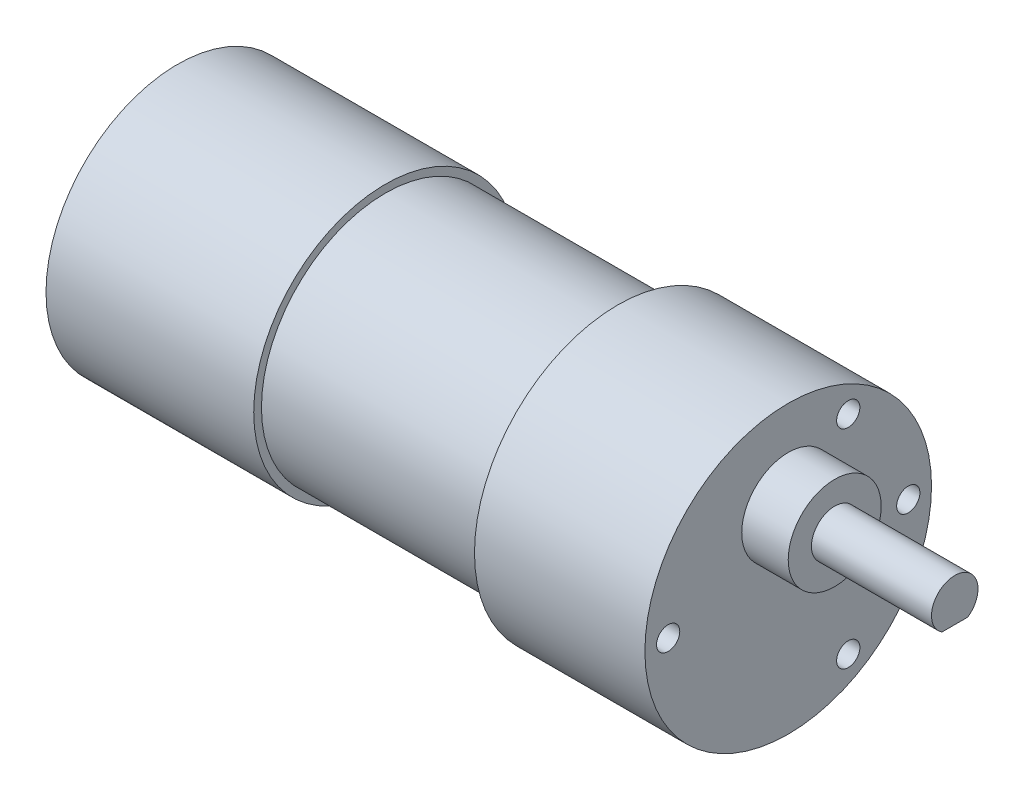
ISO-10303-21;
HEADER;
FILE_DESCRIPTION(('STEP AP214'),'2;1');
FILE_NAME('part.step','',(''),(''),'','','');
FILE_SCHEMA(('AUTOMOTIVE_DESIGN { 1 0 10303 214 1 1 1 1 }'));
ENDSEC;
DATA;
#1=APPLICATION_CONTEXT('core data for automotive mechanical design processes');
#2=APPLICATION_PROTOCOL_DEFINITION('international standard','automotive_design',2000,#1);
#3=PRODUCT_CONTEXT('',#1,'mechanical');
#4=PRODUCT('Part','Part','',(#3));
#5=PRODUCT_RELATED_PRODUCT_CATEGORY('part','',(#4));
#6=PRODUCT_DEFINITION_FORMATION('','',#4);
#7=PRODUCT_DEFINITION_CONTEXT('part definition',#1,'design');
#8=PRODUCT_DEFINITION('design','',#6,#7);
#9=PRODUCT_DEFINITION_SHAPE('','',#8);
#10=(LENGTH_UNIT() NAMED_UNIT(*) SI_UNIT(.MILLI.,.METRE.));
#11=(NAMED_UNIT(*) PLANE_ANGLE_UNIT() SI_UNIT($,.RADIAN.));
#12=(NAMED_UNIT(*) SI_UNIT($,.STERADIAN.) SOLID_ANGLE_UNIT());
#13=UNCERTAINTY_MEASURE_WITH_UNIT(LENGTH_MEASURE(1.E-05),#10,'distance_accuracy_value','');
#14=(GEOMETRIC_REPRESENTATION_CONTEXT(3) GLOBAL_UNCERTAINTY_ASSIGNED_CONTEXT((#13)) GLOBAL_UNIT_ASSIGNED_CONTEXT((#10,
#11,#12)) REPRESENTATION_CONTEXT('',''));
#15=CARTESIAN_POINT('',(0.,0.,0.));
#16=DIRECTION('',(0.,0.,1.));
#17=DIRECTION('',(1.,0.,0.));
#18=AXIS2_PLACEMENT_3D('',#15,#16,#17);
#19=CARTESIAN_POINT('',(60.,7.,0.));
#20=DIRECTION('',(1.,0.,0.));
#21=DIRECTION('',(0.,0.,-1.));
#22=AXIS2_PLACEMENT_3D('',#19,#20,#21);
#23=PLANE('',#22);
#24=CARTESIAN_POINT('',(60.,7.,0.));
#25=DIRECTION('',(1.,0.,0.));
#26=DIRECTION('',(0.,0.,-1.));
#27=AXIS2_PLACEMENT_3D('',#24,#25,#26);
#28=CIRCLE('',#27,6.);
#29=CARTESIAN_POINT('',(60.,7.,-6.));
#30=VERTEX_POINT('',#29);
#31=EDGE_CURVE('E72',#30,#30,#28,.T.);
#32=ORIENTED_EDGE('',*,*,#31,.T.);
#33=EDGE_LOOP('',(#32));
#34=FACE_BOUND('',#33,.T.);
#35=CARTESIAN_POINT('',(60.,7.,0.));
#36=DIRECTION('',(1.,0.,0.));
#37=DIRECTION('',(0.,0.,-1.));
#38=AXIS2_PLACEMENT_3D('',#35,#36,#37);
#39=CIRCLE('',#38,3.);
#40=CARTESIAN_POINT('',(60.,7.,-3.));
#41=VERTEX_POINT('',#40);
#42=EDGE_CURVE('E73',#41,#41,#39,.T.);
#43=ORIENTED_EDGE('',*,*,#42,.F.);
#44=EDGE_LOOP('',(#43));
#45=FACE_BOUND('',#44,.T.);
#46=ADVANCED_FACE('F34',(#34,#45),#23,.T.);
#47=CARTESIAN_POINT('',(54.,18.5,0.));
#48=DIRECTION('',(-1.,0.,0.));
#49=DIRECTION('',(0.,0.,1.));
#50=AXIS2_PLACEMENT_3D('',#47,#48,#49);
#51=PLANE('',#50);
#52=CARTESIAN_POINT('',(54.,0.,15.5));
#53=DIRECTION('',(1.,0.,0.));
#54=DIRECTION('',(0.,0.,-1.));
#55=AXIS2_PLACEMENT_3D('',#52,#53,#54);
#56=CIRCLE('',#55,1.5);
#57=CARTESIAN_POINT('',(54.,0.,14.));
#58=VERTEX_POINT('',#57);
#59=EDGE_CURVE('E315',#58,#58,#56,.T.);
#60=ORIENTED_EDGE('',*,*,#59,.F.);
#61=EDGE_LOOP('',(#60));
#62=FACE_BOUND('',#61,.T.);
#63=CARTESIAN_POINT('',(54.,-13.4233937586588,-7.74999999999997));
#64=DIRECTION('',(1.,0.,0.));
#65=DIRECTION('',(0.,0.,-1.));
#66=AXIS2_PLACEMENT_3D('',#63,#64,#65);
#67=CIRCLE('',#66,1.5);
#68=CARTESIAN_POINT('',(54.,-13.4233937586588,-9.24999999999997));
#69=VERTEX_POINT('',#68);
#70=EDGE_CURVE('E325',#69,#69,#67,.T.);
#71=ORIENTED_EDGE('',*,*,#70,.F.);
#72=EDGE_LOOP('',(#71));
#73=FACE_BOUND('',#72,.T.);
#74=CARTESIAN_POINT('',(54.,13.4233937586588,-7.74999999999997));
#75=DIRECTION('',(1.,0.,0.));
#76=DIRECTION('',(0.,0.,-1.));
#77=AXIS2_PLACEMENT_3D('',#74,#75,#76);
#78=CIRCLE('',#77,1.5);
#79=CARTESIAN_POINT('',(54.,13.4233937586588,-9.24999999999997));
#80=VERTEX_POINT('',#79);
#81=EDGE_CURVE('E330',#80,#80,#78,.T.);
#82=ORIENTED_EDGE('',*,*,#81,.F.);
#83=EDGE_LOOP('',(#82));
#84=FACE_BOUND('',#83,.T.);
#85=CARTESIAN_POINT('',(54.,0.,-15.5));
#86=DIRECTION('',(1.,0.,0.));
#87=DIRECTION('',(0.,0.,-1.));
#88=AXIS2_PLACEMENT_3D('',#85,#86,#87);
#89=CIRCLE('',#88,1.5);
#90=CARTESIAN_POINT('',(54.,0.,-17.));
#91=VERTEX_POINT('',#90);
#92=EDGE_CURVE('E336',#91,#91,#89,.T.);
#93=ORIENTED_EDGE('',*,*,#92,.F.);
#94=EDGE_LOOP('',(#93));
#95=FACE_BOUND('',#94,.T.);
#96=CARTESIAN_POINT('',(54.,0.,0.));
#97=DIRECTION('',(-1.,0.,0.));
#98=DIRECTION('',(0.,0.,1.));
#99=AXIS2_PLACEMENT_3D('',#96,#97,#98);
#100=CIRCLE('',#99,18.5);
#101=CARTESIAN_POINT('',(54.,0.,18.5));
#102=VERTEX_POINT('',#101);
#103=EDGE_CURVE('E76',#102,#102,#100,.T.);
#104=ORIENTED_EDGE('',*,*,#103,.F.);
#105=EDGE_LOOP('',(#104));
#106=FACE_BOUND('',#105,.T.);
#107=CARTESIAN_POINT('',(54.,7.,0.));
#108=DIRECTION('',(-1.,0.,0.));
#109=DIRECTION('',(0.,0.,1.));
#110=AXIS2_PLACEMENT_3D('',#107,#108,#109);
#111=CIRCLE('',#110,6.);
#112=CARTESIAN_POINT('',(54.,7.,6.));
#113=VERTEX_POINT('',#112);
#114=EDGE_CURVE('E64',#113,#113,#111,.F.);
#115=ORIENTED_EDGE('',*,*,#114,.F.);
#116=EDGE_LOOP('',(#115));
#117=FACE_BOUND('',#116,.T.);
#118=ADVANCED_FACE('F98',(#62,#73,#84,#95,#106,#117),#51,.F.);
#119=CARTESIAN_POINT('',(0.,0.,0.));
#120=DIRECTION('',(-1.,0.,0.));
#121=DIRECTION('',(0.,0.,1.));
#122=AXIS2_PLACEMENT_3D('',#119,#120,#121);
#123=CYLINDRICAL_SURFACE('',#122,16.);
#124=CARTESIAN_POINT('',(2.,0.,0.));
#125=DIRECTION('',(-1.,0.,0.));
#126=DIRECTION('',(0.,0.,1.));
#127=AXIS2_PLACEMENT_3D('',#124,#125,#126);
#128=CIRCLE('',#127,16.);
#129=CARTESIAN_POINT('',(2.,0.,16.));
#130=VERTEX_POINT('',#129);
#131=EDGE_CURVE('E90',#130,#130,#128,.T.);
#132=ORIENTED_EDGE('',*,*,#131,.F.);
#133=EDGE_LOOP('',(#132));
#134=FACE_BOUND('',#133,.T.);
#135=CARTESIAN_POINT('',(32.,0.,0.));
#136=DIRECTION('',(-1.,0.,0.));
#137=DIRECTION('',(0.,0.,1.));
#138=AXIS2_PLACEMENT_3D('',#135,#136,#137);
#139=CIRCLE('',#138,16.);
#140=CARTESIAN_POINT('',(32.,0.,16.));
#141=VERTEX_POINT('',#140);
#142=EDGE_CURVE('E87',#141,#141,#139,.T.);
#143=ORIENTED_EDGE('',*,*,#142,.T.);
#144=EDGE_LOOP('',(#143));
#145=FACE_BOUND('',#144,.T.);
#146=ADVANCED_FACE('F36',(#134,#145),#123,.T.);
#147=CARTESIAN_POINT('',(32.,16.,0.));
#148=DIRECTION('',(1.,0.,0.));
#149=DIRECTION('',(0.,0.,-1.));
#150=AXIS2_PLACEMENT_3D('',#147,#148,#149);
#151=PLANE('',#150);
#152=ORIENTED_EDGE('',*,*,#142,.F.);
#153=EDGE_LOOP('',(#152));
#154=FACE_BOUND('',#153,.T.);
#155=CARTESIAN_POINT('',(32.,0.,0.));
#156=DIRECTION('',(-1.,0.,0.));
#157=DIRECTION('',(0.,0.,1.));
#158=AXIS2_PLACEMENT_3D('',#155,#156,#157);
#159=CIRCLE('',#158,18.5);
#160=CARTESIAN_POINT('',(32.,0.,18.5));
#161=VERTEX_POINT('',#160);
#162=EDGE_CURVE('E84',#161,#161,#159,.T.);
#163=ORIENTED_EDGE('',*,*,#162,.T.);
#164=EDGE_LOOP('',(#163));
#165=FACE_BOUND('',#164,.T.);
#166=ADVANCED_FACE('F106',(#154,#165),#151,.F.);
#167=CARTESIAN_POINT('',(0.,0.,0.));
#168=DIRECTION('',(-1.,0.,0.));
#169=DIRECTION('',(0.,0.,1.));
#170=AXIS2_PLACEMENT_3D('',#167,#168,#169);
#171=CYLINDRICAL_SURFACE('',#170,18.5);
#172=ORIENTED_EDGE('',*,*,#162,.F.);
#173=EDGE_LOOP('',(#172));
#174=FACE_BOUND('',#173,.T.);
#175=ORIENTED_EDGE('',*,*,#103,.T.);
#176=EDGE_LOOP('',(#175));
#177=FACE_BOUND('',#176,.T.);
#178=ADVANCED_FACE('F114',(#174,#177),#171,.T.);
#179=CARTESIAN_POINT('',(60.,7.,0.));
#180=DIRECTION('',(-1.,0.,0.));
#181=DIRECTION('',(0.,0.,1.));
#182=AXIS2_PLACEMENT_3D('',#179,#180,#181);
#183=CYLINDRICAL_SURFACE('',#182,6.);
#184=ORIENTED_EDGE('',*,*,#31,.F.);
#185=EDGE_LOOP('',(#184));
#186=FACE_BOUND('',#185,.T.);
#187=ORIENTED_EDGE('',*,*,#114,.T.);
#188=EDGE_LOOP('',(#187));
#189=FACE_BOUND('',#188,.T.);
#190=ADVANCED_FACE('F96',(#186,#189),#183,.T.);
#191=CARTESIAN_POINT('',(75.5,7.,0.));
#192=DIRECTION('',(-1.,0.,0.));
#193=DIRECTION('',(0.,0.,1.));
#194=AXIS2_PLACEMENT_3D('',#191,#192,#193);
#195=CYLINDRICAL_SURFACE('',#194,3.);
#196=CARTESIAN_POINT('',(75.5,7.,0.));
#197=DIRECTION('',(1.,0.,0.));
#198=DIRECTION('',(0.,0.,-1.));
#199=AXIS2_PLACEMENT_3D('',#196,#197,#198);
#200=CIRCLE('',#199,3.);
#201=CARTESIAN_POINT('',(75.5,4.5,-1.6583123951777));
#202=VERTEX_POINT('',#201);
#203=CARTESIAN_POINT('',(75.5,4.5,1.6583123951777));
#204=VERTEX_POINT('',#203);
#205=EDGE_CURVE('E68',#202,#204,#200,.T.);
#206=ORIENTED_EDGE('',*,*,#205,.F.);
#207=DIRECTION('',(-1.,0.,0.));
#208=VECTOR('',#207,1.);
#209=CARTESIAN_POINT('',(75.5,4.5,-1.6583123951777));
#210=LINE('',#209,#208);
#211=CARTESIAN_POINT('',(63.5,4.5,-1.6583123951777));
#212=VERTEX_POINT('',#211);
#213=EDGE_CURVE('E49',#202,#212,#210,.T.);
#214=ORIENTED_EDGE('',*,*,#213,.T.);
#215=CARTESIAN_POINT('',(63.5,7.,0.));
#216=DIRECTION('',(-1.,0.,0.));
#217=DIRECTION('',(0.,0.,1.));
#218=AXIS2_PLACEMENT_3D('',#215,#216,#217);
#219=CIRCLE('',#218,3.);
#220=CARTESIAN_POINT('',(63.5,4.5,1.6583123951777));
#221=VERTEX_POINT('',#220);
#222=EDGE_CURVE('E11',#212,#221,#219,.T.);
#223=ORIENTED_EDGE('',*,*,#222,.T.);
#224=DIRECTION('',(-1.,0.,0.));
#225=VECTOR('',#224,1.);
#226=CARTESIAN_POINT('',(75.5,4.5,1.6583123951777));
#227=LINE('',#226,#225);
#228=EDGE_CURVE('E54',#221,#204,#227,.F.);
#229=ORIENTED_EDGE('',*,*,#228,.T.);
#230=EDGE_LOOP('',(#206,#214,#223,#229));
#231=FACE_BOUND('',#230,.T.);
#232=ORIENTED_EDGE('',*,*,#42,.T.);
#233=EDGE_LOOP('',(#232));
#234=FACE_BOUND('',#233,.T.);
#235=ADVANCED_FACE('F66',(#231,#234),#195,.T.);
#236=CARTESIAN_POINT('',(75.5,7.,0.));
#237=DIRECTION('',(1.,0.,0.));
#238=DIRECTION('',(0.,0.,-1.));
#239=AXIS2_PLACEMENT_3D('',#236,#237,#238);
#240=PLANE('',#239);
#241=DIRECTION('',(0.,0.,1.));
#242=VECTOR('',#241,1.);
#243=CARTESIAN_POINT('',(75.5,4.5,0.));
#244=LINE('',#243,#242);
#245=EDGE_CURVE('E42',#202,#204,#244,.T.);
#246=ORIENTED_EDGE('',*,*,#245,.F.);
#247=ORIENTED_EDGE('',*,*,#205,.T.);
#248=EDGE_LOOP('',(#246,#247));
#249=FACE_BOUND('',#248,.T.);
#250=ADVANCED_FACE('F71',(#249),#240,.T.);
#251=CARTESIAN_POINT('',(63.5,4.,-7.75));
#252=DIRECTION('',(-1.,0.,0.));
#253=DIRECTION('',(0.,0.,1.));
#254=AXIS2_PLACEMENT_3D('',#251,#252,#253);
#255=PLANE('',#254);
#256=DIRECTION('',(0.,0.,1.));
#257=VECTOR('',#256,1.);
#258=CARTESIAN_POINT('',(63.5,4.5,-7.75));
#259=LINE('',#258,#257);
#260=EDGE_CURVE('E69',#212,#221,#259,.T.);
#261=ORIENTED_EDGE('',*,*,#260,.T.);
#262=ORIENTED_EDGE('',*,*,#222,.F.);
#263=EDGE_LOOP('',(#261,#262));
#264=FACE_BOUND('',#263,.T.);
#265=ADVANCED_FACE('F153',(#264),#255,.F.);
#266=CARTESIAN_POINT('',(75.5,4.5,-7.75));
#267=DIRECTION('',(0.,1.,0.));
#268=DIRECTION('',(-1.,0.,0.));
#269=AXIS2_PLACEMENT_3D('',#266,#267,#268);
#270=PLANE('',#269);
#271=ORIENTED_EDGE('',*,*,#245,.T.);
#272=ORIENTED_EDGE('',*,*,#228,.F.);
#273=ORIENTED_EDGE('',*,*,#260,.F.);
#274=ORIENTED_EDGE('',*,*,#213,.F.);
#275=EDGE_LOOP('',(#271,#272,#273,#274));
#276=FACE_BOUND('',#275,.T.);
#277=ADVANCED_FACE('F60',(#276),#270,.F.);
#278=CARTESIAN_POINT('',(50.5,0.,-15.5));
#279=DIRECTION('',(1.,0.,0.));
#280=DIRECTION('',(0.,0.,-1.));
#281=AXIS2_PLACEMENT_3D('',#278,#279,#280);
#282=CYLINDRICAL_SURFACE('',#281,1.5);
#283=CARTESIAN_POINT('',(50.5,0.,-15.5));
#284=DIRECTION('',(1.,0.,0.));
#285=DIRECTION('',(0.,0.,-1.));
#286=AXIS2_PLACEMENT_3D('',#283,#284,#285);
#287=CIRCLE('',#286,1.5);
#288=CARTESIAN_POINT('',(50.5,0.,-17.));
#289=VERTEX_POINT('',#288);
#290=EDGE_CURVE('E339',#289,#289,#287,.T.);
#291=ORIENTED_EDGE('',*,*,#290,.F.);
#292=EDGE_LOOP('',(#291));
#293=FACE_BOUND('',#292,.T.);
#294=ORIENTED_EDGE('',*,*,#92,.T.);
#295=EDGE_LOOP('',(#294));
#296=FACE_BOUND('',#295,.T.);
#297=ADVANCED_FACE('F167',(#293,#296),#282,.F.);
#298=CARTESIAN_POINT('',(50.5,0.,-15.5));
#299=DIRECTION('',(1.,0.,0.));
#300=DIRECTION('',(0.,0.,-1.));
#301=AXIS2_PLACEMENT_3D('',#298,#299,#300);
#302=PLANE('',#301);
#303=ORIENTED_EDGE('',*,*,#290,.T.);
#304=EDGE_LOOP('',(#303));
#305=FACE_BOUND('',#304,.T.);
#306=ADVANCED_FACE('F174',(#305),#302,.T.);
#307=CARTESIAN_POINT('',(50.5,13.4233937586588,-7.74999999999997));
#308=DIRECTION('',(1.,0.,0.));
#309=DIRECTION('',(0.,0.,-1.));
#310=AXIS2_PLACEMENT_3D('',#307,#308,#309);
#311=CYLINDRICAL_SURFACE('',#310,1.5);
#312=CARTESIAN_POINT('',(50.5,13.4233937586588,-7.74999999999997));
#313=DIRECTION('',(1.,0.,0.));
#314=DIRECTION('',(0.,0.,-1.));
#315=AXIS2_PLACEMENT_3D('',#312,#313,#314);
#316=CIRCLE('',#315,1.5);
#317=CARTESIAN_POINT('',(50.5,13.4233937586588,-9.24999999999997));
#318=VERTEX_POINT('',#317);
#319=EDGE_CURVE('E333',#318,#318,#316,.T.);
#320=ORIENTED_EDGE('',*,*,#319,.F.);
#321=EDGE_LOOP('',(#320));
#322=FACE_BOUND('',#321,.T.);
#323=ORIENTED_EDGE('',*,*,#81,.T.);
#324=EDGE_LOOP('',(#323));
#325=FACE_BOUND('',#324,.T.);
#326=ADVANCED_FACE('F182',(#322,#325),#311,.F.);
#327=CARTESIAN_POINT('',(50.5,13.4233937586588,-7.74999999999997));
#328=DIRECTION('',(1.,0.,0.));
#329=DIRECTION('',(0.,0.,-1.));
#330=AXIS2_PLACEMENT_3D('',#327,#328,#329);
#331=PLANE('',#330);
#332=ORIENTED_EDGE('',*,*,#319,.T.);
#333=EDGE_LOOP('',(#332));
#334=FACE_BOUND('',#333,.T.);
#335=ADVANCED_FACE('F190',(#334),#331,.T.);
#336=CARTESIAN_POINT('',(50.5,-13.4233937586588,-7.74999999999997));
#337=DIRECTION('',(1.,0.,0.));
#338=DIRECTION('',(0.,0.,-1.));
#339=AXIS2_PLACEMENT_3D('',#336,#337,#338);
#340=CYLINDRICAL_SURFACE('',#339,1.5);
#341=CARTESIAN_POINT('',(50.5,-13.4233937586588,-7.74999999999997));
#342=DIRECTION('',(1.,0.,0.));
#343=DIRECTION('',(0.,0.,-1.));
#344=AXIS2_PLACEMENT_3D('',#341,#342,#343);
#345=CIRCLE('',#344,1.5);
#346=CARTESIAN_POINT('',(50.5,-13.4233937586588,-9.24999999999997));
#347=VERTEX_POINT('',#346);
#348=EDGE_CURVE('E327',#347,#347,#345,.T.);
#349=ORIENTED_EDGE('',*,*,#348,.F.);
#350=EDGE_LOOP('',(#349));
#351=FACE_BOUND('',#350,.T.);
#352=ORIENTED_EDGE('',*,*,#70,.T.);
#353=EDGE_LOOP('',(#352));
#354=FACE_BOUND('',#353,.T.);
#355=ADVANCED_FACE('F198',(#351,#354),#340,.F.);
#356=CARTESIAN_POINT('',(50.5,-13.4233937586588,-7.74999999999997));
#357=DIRECTION('',(1.,0.,0.));
#358=DIRECTION('',(0.,0.,-1.));
#359=AXIS2_PLACEMENT_3D('',#356,#357,#358);
#360=PLANE('',#359);
#361=ORIENTED_EDGE('',*,*,#348,.T.);
#362=EDGE_LOOP('',(#361));
#363=FACE_BOUND('',#362,.T.);
#364=ADVANCED_FACE('F206',(#363),#360,.T.);
#365=CARTESIAN_POINT('',(50.5,0.,15.5));
#366=DIRECTION('',(1.,0.,0.));
#367=DIRECTION('',(0.,0.,-1.));
#368=AXIS2_PLACEMENT_3D('',#365,#366,#367);
#369=CYLINDRICAL_SURFACE('',#368,1.5);
#370=CARTESIAN_POINT('',(50.5,0.,15.5));
#371=DIRECTION('',(1.,0.,0.));
#372=DIRECTION('',(0.,0.,-1.));
#373=AXIS2_PLACEMENT_3D('',#370,#371,#372);
#374=CIRCLE('',#373,1.5);
#375=CARTESIAN_POINT('',(50.5,0.,14.));
#376=VERTEX_POINT('',#375);
#377=EDGE_CURVE('E319',#376,#376,#374,.T.);
#378=ORIENTED_EDGE('',*,*,#377,.F.);
#379=EDGE_LOOP('',(#378));
#380=FACE_BOUND('',#379,.T.);
#381=ORIENTED_EDGE('',*,*,#59,.T.);
#382=EDGE_LOOP('',(#381));
#383=FACE_BOUND('',#382,.T.);
#384=ADVANCED_FACE('F214',(#380,#383),#369,.F.);
#385=CARTESIAN_POINT('',(50.5,0.,15.5));
#386=DIRECTION('',(1.,0.,0.));
#387=DIRECTION('',(0.,0.,-1.));
#388=AXIS2_PLACEMENT_3D('',#385,#386,#387);
#389=PLANE('',#388);
#390=ORIENTED_EDGE('',*,*,#377,.T.);
#391=EDGE_LOOP('',(#390));
#392=FACE_BOUND('',#391,.T.);
#393=ADVANCED_FACE('F222',(#392),#389,.T.);
#394=CARTESIAN_POINT('',(2.,0.,0.));
#395=DIRECTION('',(-1.,0.,0.));
#396=DIRECTION('',(0.,0.,1.));
#397=AXIS2_PLACEMENT_3D('',#394,#395,#396);
#398=PLANE('',#397);
#399=CARTESIAN_POINT('',(2.,0.,0.));
#400=DIRECTION('',(-1.,0.,0.));
#401=DIRECTION('',(0.,0.,1.));
#402=AXIS2_PLACEMENT_3D('',#399,#400,#401);
#403=CIRCLE('',#402,17.);
#404=CARTESIAN_POINT('',(2.,0.,17.));
#405=VERTEX_POINT('',#404);
#406=EDGE_CURVE('E316',#405,#405,#403,.T.);
#407=ORIENTED_EDGE('',*,*,#406,.F.);
#408=EDGE_LOOP('',(#407));
#409=FACE_BOUND('',#408,.T.);
#410=ORIENTED_EDGE('',*,*,#131,.T.);
#411=EDGE_LOOP('',(#410));
#412=FACE_BOUND('',#411,.T.);
#413=ADVANCED_FACE('F230',(#409,#412),#398,.F.);
#414=CARTESIAN_POINT('',(-24.8133173693633,0.,0.));
#415=DIRECTION('',(1.,0.,0.));
#416=DIRECTION('',(0.,0.,-1.));
#417=AXIS2_PLACEMENT_3D('',#414,#415,#416);
#418=CYLINDRICAL_SURFACE('',#417,17.);
#419=CARTESIAN_POINT('',(-24.8133173693633,0.,0.));
#420=DIRECTION('',(-1.,0.,0.));
#421=DIRECTION('',(0.,0.,1.));
#422=AXIS2_PLACEMENT_3D('',#419,#420,#421);
#423=CIRCLE('',#422,17.);
#424=CARTESIAN_POINT('',(-24.8133173693633,0.,17.));
#425=VERTEX_POINT('',#424);
#426=EDGE_CURVE('E314',#425,#425,#423,.T.);
#427=ORIENTED_EDGE('',*,*,#426,.F.);
#428=EDGE_LOOP('',(#427));
#429=FACE_BOUND('',#428,.T.);
#430=ORIENTED_EDGE('',*,*,#406,.T.);
#431=EDGE_LOOP('',(#430));
#432=FACE_BOUND('',#431,.T.);
#433=ADVANCED_FACE('F239',(#429,#432),#418,.T.);
#434=CARTESIAN_POINT('',(-24.8133173693633,0.,0.));
#435=DIRECTION('',(-1.,0.,0.));
#436=DIRECTION('',(0.,0.,1.));
#437=AXIS2_PLACEMENT_3D('',#434,#435,#436);
#438=PLANE('',#437);
#439=ORIENTED_EDGE('',*,*,#426,.T.);
#440=EDGE_LOOP('',(#439));
#441=FACE_BOUND('',#440,.T.);
#442=ADVANCED_FACE('F247',(#441),#438,.T.);
#443=CLOSED_SHELL('',(#46,#118,#146,#166,#178,#190,#235,#250,#265,#277,#297,#306,#326,#335,#355,
#364,#384,#393,#413,#433,#442));
#444=MANIFOLD_SOLID_BREP('B2',#443);
#445=ADVANCED_BREP_SHAPE_REPRESENTATION('',(#18,#444),#14);
#446=SHAPE_DEFINITION_REPRESENTATION(#9,#445);
ENDSEC;
END-ISO-10303-21;
